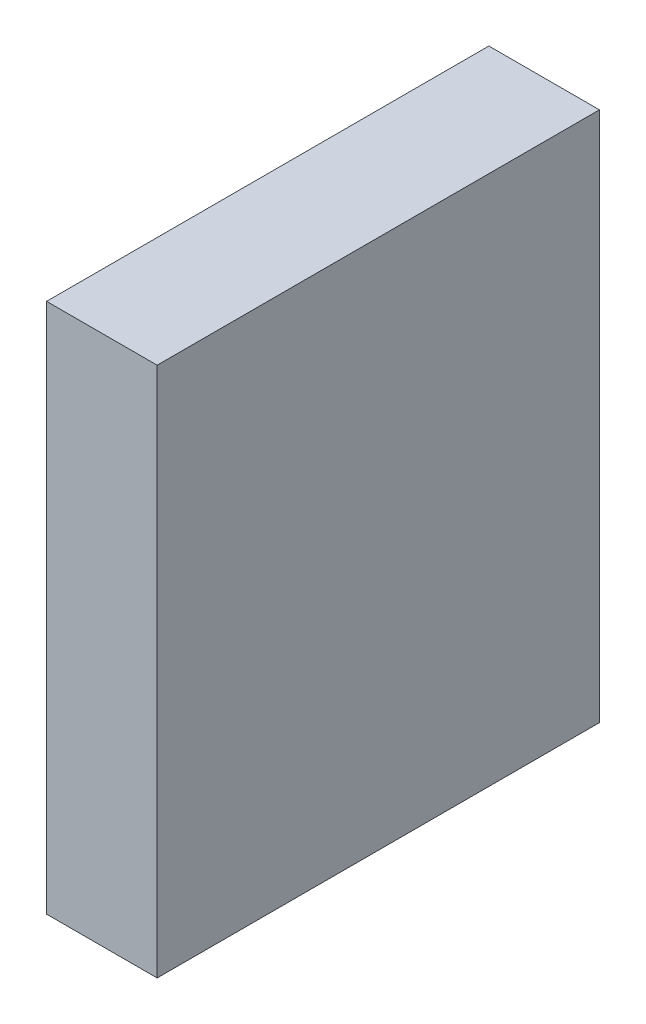
ISO-10303-21;
HEADER;
FILE_DESCRIPTION(('STEP AP214'),'2;1');
FILE_NAME('part.step','',(''),(''),'','','');
FILE_SCHEMA(('AUTOMOTIVE_DESIGN { 1 0 10303 214 1 1 1 1 }'));
ENDSEC;
DATA;
#1=APPLICATION_CONTEXT('core data for automotive mechanical design processes');
#2=APPLICATION_PROTOCOL_DEFINITION('international standard','automotive_design',2000,#1);
#3=PRODUCT_CONTEXT('',#1,'mechanical');
#4=PRODUCT('Part','Part','',(#3));
#5=PRODUCT_RELATED_PRODUCT_CATEGORY('part','',(#4));
#6=PRODUCT_DEFINITION_FORMATION('','',#4);
#7=PRODUCT_DEFINITION_CONTEXT('part definition',#1,'design');
#8=PRODUCT_DEFINITION('design','',#6,#7);
#9=PRODUCT_DEFINITION_SHAPE('','',#8);
#10=(LENGTH_UNIT() NAMED_UNIT(*) SI_UNIT(.MILLI.,.METRE.));
#11=(NAMED_UNIT(*) PLANE_ANGLE_UNIT() SI_UNIT($,.RADIAN.));
#12=(NAMED_UNIT(*) SI_UNIT($,.STERADIAN.) SOLID_ANGLE_UNIT());
#13=UNCERTAINTY_MEASURE_WITH_UNIT(LENGTH_MEASURE(1.E-05),#10,'distance_accuracy_value','');
#14=(GEOMETRIC_REPRESENTATION_CONTEXT(3) GLOBAL_UNCERTAINTY_ASSIGNED_CONTEXT((#13)) GLOBAL_UNIT_ASSIGNED_CONTEXT((#10,
#11,#12)) REPRESENTATION_CONTEXT('',''));
#15=CARTESIAN_POINT('',(0.,0.,0.));
#16=DIRECTION('',(0.,0.,1.));
#17=DIRECTION('',(1.,0.,0.));
#18=AXIS2_PLACEMENT_3D('',#15,#16,#17);
#19=CARTESIAN_POINT('',(0.75,-0.6,0.));
#20=DIRECTION('',(-1.,0.,0.));
#21=DIRECTION('',(0.,0.,1.));
#22=AXIS2_PLACEMENT_3D('',#19,#20,#21);
#23=PLANE('',#22);
#24=DIRECTION('',(0.,0.,1.));
#25=VECTOR('',#24,1.);
#26=CARTESIAN_POINT('',(0.75,0.6,0.));
#27=LINE('',#26,#25);
#28=CARTESIAN_POINT('',(0.75,0.6,0.));
#29=VERTEX_POINT('',#28);
#30=CARTESIAN_POINT('',(0.75,0.6,1.));
#31=VERTEX_POINT('',#30);
#32=EDGE_CURVE('E20',#29,#31,#27,.T.);
#33=ORIENTED_EDGE('',*,*,#32,.F.);
#34=DIRECTION('',(0.,1.,0.));
#35=VECTOR('',#34,1.);
#36=CARTESIAN_POINT('',(0.75,0.,0.));
#37=LINE('',#36,#35);
#38=CARTESIAN_POINT('',(0.75,-0.6,0.));
#39=VERTEX_POINT('',#38);
#40=EDGE_CURVE('E79',#29,#39,#37,.F.);
#41=ORIENTED_EDGE('',*,*,#40,.T.);
#42=DIRECTION('',(0.,0.,-1.));
#43=VECTOR('',#42,1.);
#44=CARTESIAN_POINT('',(0.75,-0.6,0.));
#45=LINE('',#44,#43);
#46=CARTESIAN_POINT('',(0.75,-0.6,1.));
#47=VERTEX_POINT('',#46);
#48=EDGE_CURVE('E61',#47,#39,#45,.T.);
#49=ORIENTED_EDGE('',*,*,#48,.F.);
#50=DIRECTION('',(0.,1.,0.));
#51=VECTOR('',#50,1.);
#52=CARTESIAN_POINT('',(0.75,0.,1.));
#53=LINE('',#52,#51);
#54=EDGE_CURVE('E56',#31,#47,#53,.F.);
#55=ORIENTED_EDGE('',*,*,#54,.F.);
#56=EDGE_LOOP('',(#33,#41,#49,#55));
#57=FACE_BOUND('',#56,.T.);
#58=ADVANCED_FACE('F17',(#57),#23,.T.);
#59=CARTESIAN_POINT('',(0.75,0.6,0.));
#60=DIRECTION('',(0.,1.,0.));
#61=DIRECTION('',(0.,0.,1.));
#62=AXIS2_PLACEMENT_3D('',#59,#60,#61);
#63=PLANE('',#62);
#64=DIRECTION('',(0.,0.,-1.));
#65=VECTOR('',#64,1.);
#66=CARTESIAN_POINT('',(1.,0.6,0.));
#67=LINE('',#66,#65);
#68=CARTESIAN_POINT('',(1.,0.6,0.));
#69=VERTEX_POINT('',#68);
#70=CARTESIAN_POINT('',(1.,0.6,1.));
#71=VERTEX_POINT('',#70);
#72=EDGE_CURVE('E83',#69,#71,#67,.F.);
#73=ORIENTED_EDGE('',*,*,#72,.F.);
#74=DIRECTION('',(1.,0.,0.));
#75=VECTOR('',#74,1.);
#76=CARTESIAN_POINT('',(0.875,0.6,0.));
#77=LINE('',#76,#75);
#78=EDGE_CURVE('E68',#69,#29,#77,.F.);
#79=ORIENTED_EDGE('',*,*,#78,.T.);
#80=ORIENTED_EDGE('',*,*,#32,.T.);
#81=DIRECTION('',(1.,0.,0.));
#82=VECTOR('',#81,1.);
#83=CARTESIAN_POINT('',(0.875,0.6,1.));
#84=LINE('',#83,#82);
#85=EDGE_CURVE('E63',#71,#31,#84,.F.);
#86=ORIENTED_EDGE('',*,*,#85,.F.);
#87=EDGE_LOOP('',(#73,#79,#80,#86));
#88=FACE_BOUND('',#87,.T.);
#89=ADVANCED_FACE('F65',(#88),#63,.T.);
#90=CARTESIAN_POINT('',(0.875,0.,1.));
#91=DIRECTION('',(0.,0.,1.));
#92=DIRECTION('',(1.,0.,0.));
#93=AXIS2_PLACEMENT_3D('',#90,#91,#92);
#94=PLANE('',#93);
#95=DIRECTION('',(0.,1.,0.));
#96=VECTOR('',#95,1.);
#97=CARTESIAN_POINT('',(1.,0.6,1.));
#98=LINE('',#97,#96);
#99=CARTESIAN_POINT('',(1.,-0.6,1.));
#100=VERTEX_POINT('',#99);
#101=EDGE_CURVE('E72',#71,#100,#98,.F.);
#102=ORIENTED_EDGE('',*,*,#101,.F.);
#103=ORIENTED_EDGE('',*,*,#85,.T.);
#104=ORIENTED_EDGE('',*,*,#54,.T.);
#105=DIRECTION('',(1.,0.,0.));
#106=VECTOR('',#105,1.);
#107=CARTESIAN_POINT('',(1.,-0.6,1.));
#108=LINE('',#107,#106);
#109=EDGE_CURVE('E74',#100,#47,#108,.F.);
#110=ORIENTED_EDGE('',*,*,#109,.F.);
#111=EDGE_LOOP('',(#102,#103,#104,#110));
#112=FACE_BOUND('',#111,.T.);
#113=ADVANCED_FACE('F70',(#112),#94,.T.);
#114=CARTESIAN_POINT('',(1.,-0.6,0.));
#115=DIRECTION('',(0.,-1.,0.));
#116=DIRECTION('',(0.,0.,-1.));
#117=AXIS2_PLACEMENT_3D('',#114,#115,#116);
#118=PLANE('',#117);
#119=ORIENTED_EDGE('',*,*,#48,.T.);
#120=DIRECTION('',(1.,0.,0.));
#121=VECTOR('',#120,1.);
#122=CARTESIAN_POINT('',(0.875,-0.6,0.));
#123=LINE('',#122,#121);
#124=CARTESIAN_POINT('',(1.,-0.6,0.));
#125=VERTEX_POINT('',#124);
#126=EDGE_CURVE('E35',#39,#125,#123,.T.);
#127=ORIENTED_EDGE('',*,*,#126,.T.);
#128=DIRECTION('',(0.,0.,-1.));
#129=VECTOR('',#128,1.);
#130=CARTESIAN_POINT('',(1.,-0.6,0.));
#131=LINE('',#130,#129);
#132=EDGE_CURVE('E26',#100,#125,#131,.T.);
#133=ORIENTED_EDGE('',*,*,#132,.F.);
#134=ORIENTED_EDGE('',*,*,#109,.T.);
#135=EDGE_LOOP('',(#119,#127,#133,#134));
#136=FACE_BOUND('',#135,.T.);
#137=ADVANCED_FACE('F89',(#136),#118,.T.);
#138=CARTESIAN_POINT('',(0.875,0.,0.));
#139=DIRECTION('',(0.,0.,1.));
#140=DIRECTION('',(1.,0.,0.));
#141=AXIS2_PLACEMENT_3D('',#138,#139,#140);
#142=PLANE('',#141);
#143=DIRECTION('',(0.,1.,0.));
#144=VECTOR('',#143,1.);
#145=CARTESIAN_POINT('',(1.,0.6,0.));
#146=LINE('',#145,#144);
#147=EDGE_CURVE('E11',#125,#69,#146,.T.);
#148=ORIENTED_EDGE('',*,*,#147,.F.);
#149=ORIENTED_EDGE('',*,*,#126,.F.);
#150=ORIENTED_EDGE('',*,*,#40,.F.);
#151=ORIENTED_EDGE('',*,*,#78,.F.);
#152=EDGE_LOOP('',(#148,#149,#150,#151));
#153=FACE_BOUND('',#152,.T.);
#154=ADVANCED_FACE('F91',(#153),#142,.F.);
#155=CARTESIAN_POINT('',(1.,0.6,0.));
#156=DIRECTION('',(1.,0.,0.));
#157=DIRECTION('',(0.,0.,-1.));
#158=AXIS2_PLACEMENT_3D('',#155,#156,#157);
#159=PLANE('',#158);
#160=ORIENTED_EDGE('',*,*,#132,.T.);
#161=ORIENTED_EDGE('',*,*,#147,.T.);
#162=ORIENTED_EDGE('',*,*,#72,.T.);
#163=ORIENTED_EDGE('',*,*,#101,.T.);
#164=EDGE_LOOP('',(#160,#161,#162,#163));
#165=FACE_BOUND('',#164,.T.);
#166=ADVANCED_FACE('F88',(#165),#159,.T.);
#167=CLOSED_SHELL('',(#58,#89,#113,#137,#154,#166));
#168=MANIFOLD_SOLID_BREP('B1',#167);
#169=ADVANCED_BREP_SHAPE_REPRESENTATION('',(#18,#168),#14);
#170=SHAPE_DEFINITION_REPRESENTATION(#9,#169);
ENDSEC;
END-ISO-10303-21;
